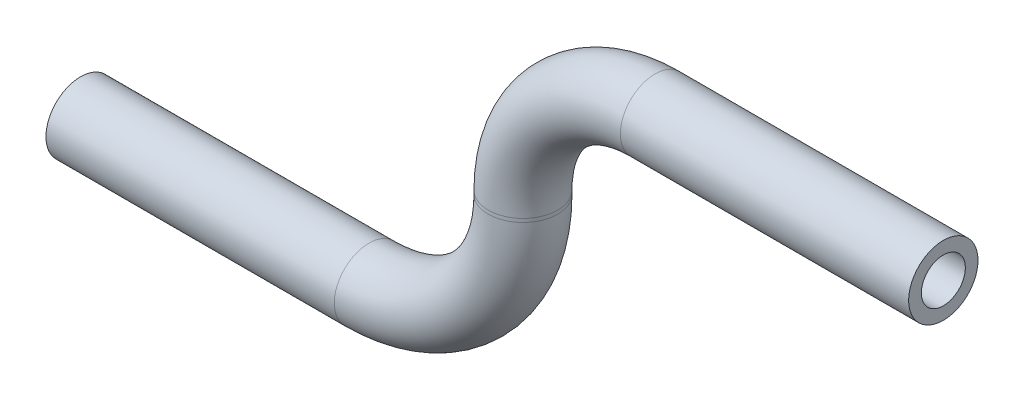
ISO-10303-21;
HEADER;
FILE_DESCRIPTION(('STEP AP214'),'2;1');
FILE_NAME('part.step','',(''),(''),'','','');
FILE_SCHEMA(('AUTOMOTIVE_DESIGN { 1 0 10303 214 1 1 1 1 }'));
ENDSEC;
DATA;
#1=APPLICATION_CONTEXT('core data for automotive mechanical design processes');
#2=APPLICATION_PROTOCOL_DEFINITION('international standard','automotive_design',2000,#1);
#3=PRODUCT_CONTEXT('',#1,'mechanical');
#4=PRODUCT('Part','Part','',(#3));
#5=PRODUCT_RELATED_PRODUCT_CATEGORY('part','',(#4));
#6=PRODUCT_DEFINITION_FORMATION('','',#4);
#7=PRODUCT_DEFINITION_CONTEXT('part definition',#1,'design');
#8=PRODUCT_DEFINITION('design','',#6,#7);
#9=PRODUCT_DEFINITION_SHAPE('','',#8);
#10=(LENGTH_UNIT() NAMED_UNIT(*) SI_UNIT(.MILLI.,.METRE.));
#11=(NAMED_UNIT(*) PLANE_ANGLE_UNIT() SI_UNIT($,.RADIAN.));
#12=(NAMED_UNIT(*) SI_UNIT($,.STERADIAN.) SOLID_ANGLE_UNIT());
#13=UNCERTAINTY_MEASURE_WITH_UNIT(LENGTH_MEASURE(1.E-05),#10,'distance_accuracy_value','');
#14=(GEOMETRIC_REPRESENTATION_CONTEXT(3) GLOBAL_UNCERTAINTY_ASSIGNED_CONTEXT((#13)) GLOBAL_UNIT_ASSIGNED_CONTEXT((#10,
#11,#12)) REPRESENTATION_CONTEXT('',''));
#15=CARTESIAN_POINT('',(0.,0.,0.));
#16=DIRECTION('',(0.,0.,1.));
#17=DIRECTION('',(1.,0.,0.));
#18=AXIS2_PLACEMENT_3D('',#15,#16,#17);
#19=CARTESIAN_POINT('',(0.,0.,0.));
#20=DIRECTION('',(1.,0.,0.));
#21=DIRECTION('',(0.,1.,0.));
#22=AXIS2_PLACEMENT_3D('',#19,#20,#21);
#23=CYLINDRICAL_SURFACE('',#22,4.);
#24=CARTESIAN_POINT('',(33.274,0.,0.));
#25=DIRECTION('',(1.,0.,0.));
#26=DIRECTION('',(0.,0.,-1.));
#27=AXIS2_PLACEMENT_3D('',#24,#25,#26);
#28=CIRCLE('',#27,4.);
#29=CARTESIAN_POINT('',(33.274,-3.99999999999999,0.));
#30=VERTEX_POINT('',#29);
#31=EDGE_CURVE('E56',#30,#30,#28,.T.);
#32=ORIENTED_EDGE('',*,*,#31,.F.);
#33=EDGE_LOOP('',(#32));
#34=FACE_BOUND('',#33,.T.);
#35=CARTESIAN_POINT('',(0.,0.,0.));
#36=DIRECTION('',(1.,0.,0.));
#37=DIRECTION('',(0.,0.,-1.));
#38=AXIS2_PLACEMENT_3D('',#35,#36,#37);
#39=CIRCLE('',#38,4.);
#40=CARTESIAN_POINT('',(0.,0.,-4.));
#41=VERTEX_POINT('',#40);
#42=EDGE_CURVE('E53',#41,#41,#39,.T.);
#43=ORIENTED_EDGE('',*,*,#42,.T.);
#44=EDGE_LOOP('',(#43));
#45=FACE_BOUND('',#44,.T.);
#46=ADVANCED_FACE('F32',(#34,#45),#23,.T.);
#47=CARTESIAN_POINT('',(33.274,17.78,0.));
#48=DIRECTION('',(0.,0.,1.));
#49=DIRECTION('',(1.,0.,0.));
#50=AXIS2_PLACEMENT_3D('',#47,#48,#49);
#51=TOROIDAL_SURFACE('',#50,17.78,4.);
#52=CARTESIAN_POINT('',(51.054,17.78,0.));
#53=DIRECTION('',(0.,1.,0.));
#54=DIRECTION('',(0.,0.,-1.));
#55=AXIS2_PLACEMENT_3D('',#52,#53,#54);
#56=CIRCLE('',#55,4.);
#57=CARTESIAN_POINT('',(55.054,17.78,0.));
#58=VERTEX_POINT('',#57);
#59=EDGE_CURVE('E59',#58,#58,#56,.T.);
#60=CARTESIAN_POINT('',(33.274,17.78,0.));
#61=DIRECTION('',(0.,0.,1.));
#62=DIRECTION('',(1.,0.,0.));
#63=AXIS2_PLACEMENT_3D('',#60,#61,#62);
#64=CIRCLE('',#63,21.78);
#65=EDGE_CURVE('',#30,#58,#64,.T.);
#66=ORIENTED_EDGE('',*,*,#31,.T.);
#67=ORIENTED_EDGE('',*,*,#59,.F.);
#68=ORIENTED_EDGE('',*,*,#65,.T.);
#69=ORIENTED_EDGE('',*,*,#65,.F.);
#70=EDGE_LOOP('',(#66,#68,#67,#69));
#71=FACE_BOUND('',#70,.T.);
#72=ADVANCED_FACE('F78',(#71),#51,.T.);
#73=CARTESIAN_POINT('',(51.054,17.78,0.));
#74=DIRECTION('',(0.,1.,0.));
#75=DIRECTION('',(0.,0.,1.));
#76=AXIS2_PLACEMENT_3D('',#73,#74,#75);
#77=CYLINDRICAL_SURFACE('',#76,4.);
#78=CARTESIAN_POINT('',(51.054,18.1864,0.));
#79=DIRECTION('',(0.,1.,0.));
#80=DIRECTION('',(0.,0.,-1.));
#81=AXIS2_PLACEMENT_3D('',#78,#79,#80);
#82=CIRCLE('',#81,4.);
#83=CARTESIAN_POINT('',(47.054,18.1864,0.));
#84=VERTEX_POINT('',#83);
#85=EDGE_CURVE('E61',#84,#84,#82,.T.);
#86=ORIENTED_EDGE('',*,*,#85,.F.);
#87=EDGE_LOOP('',(#86));
#88=FACE_BOUND('',#87,.T.);
#89=ORIENTED_EDGE('',*,*,#59,.T.);
#90=EDGE_LOOP('',(#89));
#91=FACE_BOUND('',#90,.T.);
#92=ADVANCED_FACE('F71',(#88,#91),#77,.T.);
#93=CARTESIAN_POINT('',(66.294,18.1864,0.));
#94=DIRECTION('',(0.,0.,-1.));
#95=DIRECTION('',(-1.,0.,0.));
#96=AXIS2_PLACEMENT_3D('',#93,#94,#95);
#97=TOROIDAL_SURFACE('',#96,15.24,4.);
#98=CARTESIAN_POINT('',(66.294,33.4264,0.));
#99=DIRECTION('',(1.,0.,0.));
#100=DIRECTION('',(0.,0.,-1.));
#101=AXIS2_PLACEMENT_3D('',#98,#99,#100);
#102=CIRCLE('',#101,4.);
#103=CARTESIAN_POINT('',(66.294,37.4264,0.));
#104=VERTEX_POINT('',#103);
#105=EDGE_CURVE('E36',#104,#104,#102,.T.);
#106=CARTESIAN_POINT('',(66.294,18.1864,0.));
#107=DIRECTION('',(0.,0.,-1.));
#108=DIRECTION('',(-1.,0.,0.));
#109=AXIS2_PLACEMENT_3D('',#106,#107,#108);
#110=CIRCLE('',#109,19.24);
#111=EDGE_CURVE('',#84,#104,#110,.T.);
#112=ORIENTED_EDGE('',*,*,#85,.T.);
#113=ORIENTED_EDGE('',*,*,#105,.F.);
#114=ORIENTED_EDGE('',*,*,#111,.T.);
#115=ORIENTED_EDGE('',*,*,#111,.F.);
#116=EDGE_LOOP('',(#112,#114,#113,#115));
#117=FACE_BOUND('',#116,.T.);
#118=ADVANCED_FACE('F69',(#117),#97,.T.);
#119=CARTESIAN_POINT('',(66.294,33.4264,0.));
#120=DIRECTION('',(1.,0.,0.));
#121=DIRECTION('',(0.,0.,-1.));
#122=AXIS2_PLACEMENT_3D('',#119,#120,#121);
#123=CYLINDRICAL_SURFACE('',#122,4.);
#124=CARTESIAN_POINT('',(99.568,33.4264,0.));
#125=DIRECTION('',(1.,0.,0.));
#126=DIRECTION('',(0.,0.,-1.));
#127=AXIS2_PLACEMENT_3D('',#124,#125,#126);
#128=CIRCLE('',#127,4.);
#129=CARTESIAN_POINT('',(99.568,33.4264,-4.));
#130=VERTEX_POINT('',#129);
#131=EDGE_CURVE('E49',#130,#130,#128,.T.);
#132=ORIENTED_EDGE('',*,*,#131,.F.);
#133=EDGE_LOOP('',(#132));
#134=FACE_BOUND('',#133,.T.);
#135=ORIENTED_EDGE('',*,*,#105,.T.);
#136=EDGE_LOOP('',(#135));
#137=FACE_BOUND('',#136,.T.);
#138=ADVANCED_FACE('F34',(#134,#137),#123,.T.);
#139=CARTESIAN_POINT('',(0.,0.,0.));
#140=DIRECTION('',(1.,0.,0.));
#141=DIRECTION('',(0.,0.,-1.));
#142=AXIS2_PLACEMENT_3D('',#139,#140,#141);
#143=PLANE('',#142);
#144=CARTESIAN_POINT('',(0.,0.,0.));
#145=DIRECTION('',(1.,0.,0.));
#146=DIRECTION('',(0.,0.,-1.));
#147=AXIS2_PLACEMENT_3D('',#144,#145,#146);
#148=CIRCLE('',#147,2.54);
#149=CARTESIAN_POINT('',(0.,0.,-2.54));
#150=VERTEX_POINT('',#149);
#151=EDGE_CURVE('E52',#150,#150,#148,.F.);
#152=ORIENTED_EDGE('',*,*,#151,.F.);
#153=EDGE_LOOP('',(#152));
#154=FACE_BOUND('',#153,.T.);
#155=ORIENTED_EDGE('',*,*,#42,.F.);
#156=EDGE_LOOP('',(#155));
#157=FACE_BOUND('',#156,.T.);
#158=ADVANCED_FACE('F76',(#154,#157),#143,.F.);
#159=CARTESIAN_POINT('',(99.568,33.4264,0.));
#160=DIRECTION('',(1.,0.,0.));
#161=DIRECTION('',(0.,0.,-1.));
#162=AXIS2_PLACEMENT_3D('',#159,#160,#161);
#163=PLANE('',#162);
#164=CARTESIAN_POINT('',(99.568,33.4264,0.));
#165=DIRECTION('',(1.,0.,0.));
#166=DIRECTION('',(0.,0.,-1.));
#167=AXIS2_PLACEMENT_3D('',#164,#165,#166);
#168=CIRCLE('',#167,2.54);
#169=CARTESIAN_POINT('',(99.568,33.4264,-2.54));
#170=VERTEX_POINT('',#169);
#171=EDGE_CURVE('E10',#170,#170,#168,.F.);
#172=ORIENTED_EDGE('',*,*,#171,.T.);
#173=EDGE_LOOP('',(#172));
#174=FACE_BOUND('',#173,.T.);
#175=ORIENTED_EDGE('',*,*,#131,.T.);
#176=EDGE_LOOP('',(#175));
#177=FACE_BOUND('',#176,.T.);
#178=ADVANCED_FACE('F95',(#174,#177),#163,.T.);
#179=CARTESIAN_POINT('',(0.,0.,0.));
#180=DIRECTION('',(1.,0.,0.));
#181=DIRECTION('',(0.,1.,0.));
#182=AXIS2_PLACEMENT_3D('',#179,#180,#181);
#183=CYLINDRICAL_SURFACE('',#182,2.54);
#184=CARTESIAN_POINT('',(33.274,0.,0.));
#185=DIRECTION('',(1.,0.,0.));
#186=DIRECTION('',(0.,0.,-1.));
#187=AXIS2_PLACEMENT_3D('',#184,#185,#186);
#188=CIRCLE('',#187,2.54);
#189=CARTESIAN_POINT('',(33.274,-2.53999999999999,0.));
#190=VERTEX_POINT('',#189);
#191=EDGE_CURVE('E191',#190,#190,#188,.F.);
#192=ORIENTED_EDGE('',*,*,#191,.F.);
#193=EDGE_LOOP('',(#192));
#194=FACE_BOUND('',#193,.T.);
#195=ORIENTED_EDGE('',*,*,#151,.T.);
#196=EDGE_LOOP('',(#195));
#197=FACE_BOUND('',#196,.T.);
#198=ADVANCED_FACE('F98',(#194,#197),#183,.F.);
#199=CARTESIAN_POINT('',(33.274,17.78,0.));
#200=DIRECTION('',(0.,0.,1.));
#201=DIRECTION('',(1.,0.,0.));
#202=AXIS2_PLACEMENT_3D('',#199,#200,#201);
#203=TOROIDAL_SURFACE('',#202,17.78,2.54);
#204=CARTESIAN_POINT('',(51.054,17.78,0.));
#205=DIRECTION('',(0.,1.,0.));
#206=DIRECTION('',(0.,0.,-1.));
#207=AXIS2_PLACEMENT_3D('',#204,#205,#206);
#208=CIRCLE('',#207,2.54);
#209=CARTESIAN_POINT('',(53.594,17.78,0.));
#210=VERTEX_POINT('',#209);
#211=EDGE_CURVE('E190',#210,#210,#208,.F.);
#212=CARTESIAN_POINT('',(33.274,17.78,0.));
#213=DIRECTION('',(0.,0.,1.));
#214=DIRECTION('',(1.,0.,0.));
#215=AXIS2_PLACEMENT_3D('',#212,#213,#214);
#216=CIRCLE('',#215,20.32);
#217=EDGE_CURVE('',#190,#210,#216,.T.);
#218=ORIENTED_EDGE('',*,*,#191,.T.);
#219=ORIENTED_EDGE('',*,*,#211,.F.);
#220=ORIENTED_EDGE('',*,*,#217,.T.);
#221=ORIENTED_EDGE('',*,*,#217,.F.);
#222=EDGE_LOOP('',(#218,#220,#219,#221));
#223=FACE_BOUND('',#222,.T.);
#224=ADVANCED_FACE('F153',(#223),#203,.F.);
#225=CARTESIAN_POINT('',(51.054,17.78,0.));
#226=DIRECTION('',(0.,1.,0.));
#227=DIRECTION('',(0.,0.,1.));
#228=AXIS2_PLACEMENT_3D('',#225,#226,#227);
#229=CYLINDRICAL_SURFACE('',#228,2.54);
#230=CARTESIAN_POINT('',(51.054,18.1864,0.));
#231=DIRECTION('',(0.,1.,0.));
#232=DIRECTION('',(0.,0.,-1.));
#233=AXIS2_PLACEMENT_3D('',#230,#231,#232);
#234=CIRCLE('',#233,2.54);
#235=CARTESIAN_POINT('',(48.514,18.1864,0.));
#236=VERTEX_POINT('',#235);
#237=EDGE_CURVE('E45',#236,#236,#234,.F.);
#238=ORIENTED_EDGE('',*,*,#237,.F.);
#239=EDGE_LOOP('',(#238));
#240=FACE_BOUND('',#239,.T.);
#241=ORIENTED_EDGE('',*,*,#211,.T.);
#242=EDGE_LOOP('',(#241));
#243=FACE_BOUND('',#242,.T.);
#244=ADVANCED_FACE('F89',(#240,#243),#229,.F.);
#245=CARTESIAN_POINT('',(66.294,18.1864,0.));
#246=DIRECTION('',(0.,0.,-1.));
#247=DIRECTION('',(-1.,0.,0.));
#248=AXIS2_PLACEMENT_3D('',#245,#246,#247);
#249=TOROIDAL_SURFACE('',#248,15.24,2.54);
#250=CARTESIAN_POINT('',(66.294,33.4264,0.));
#251=DIRECTION('',(1.,0.,0.));
#252=DIRECTION('',(0.,0.,-1.));
#253=AXIS2_PLACEMENT_3D('',#250,#251,#252);
#254=CIRCLE('',#253,2.54);
#255=CARTESIAN_POINT('',(66.294,35.9664,0.));
#256=VERTEX_POINT('',#255);
#257=EDGE_CURVE('E40',#256,#256,#254,.F.);
#258=CARTESIAN_POINT('',(66.294,18.1864,0.));
#259=DIRECTION('',(0.,0.,-1.));
#260=DIRECTION('',(-1.,0.,0.));
#261=AXIS2_PLACEMENT_3D('',#258,#259,#260);
#262=CIRCLE('',#261,17.78);
#263=EDGE_CURVE('',#236,#256,#262,.T.);
#264=ORIENTED_EDGE('',*,*,#237,.T.);
#265=ORIENTED_EDGE('',*,*,#257,.F.);
#266=ORIENTED_EDGE('',*,*,#263,.T.);
#267=ORIENTED_EDGE('',*,*,#263,.F.);
#268=EDGE_LOOP('',(#264,#266,#265,#267));
#269=FACE_BOUND('',#268,.T.);
#270=ADVANCED_FACE('F83',(#269),#249,.F.);
#271=CARTESIAN_POINT('',(66.294,33.4264,0.));
#272=DIRECTION('',(1.,0.,0.));
#273=DIRECTION('',(0.,0.,-1.));
#274=AXIS2_PLACEMENT_3D('',#271,#272,#273);
#275=CYLINDRICAL_SURFACE('',#274,2.54);
#276=ORIENTED_EDGE('',*,*,#171,.F.);
#277=EDGE_LOOP('',(#276));
#278=FACE_BOUND('',#277,.T.);
#279=ORIENTED_EDGE('',*,*,#257,.T.);
#280=EDGE_LOOP('',(#279));
#281=FACE_BOUND('',#280,.T.);
#282=ADVANCED_FACE('F81',(#278,#281),#275,.F.);
#283=CLOSED_SHELL('',(#46,#72,#92,#118,#138,#158,#178,#198,#224,#244,#270,#282));
#284=MANIFOLD_SOLID_BREP('B2',#283);
#285=ADVANCED_BREP_SHAPE_REPRESENTATION('',(#18,#284),#14);
#286=SHAPE_DEFINITION_REPRESENTATION(#9,#285);
ENDSEC;
END-ISO-10303-21;
